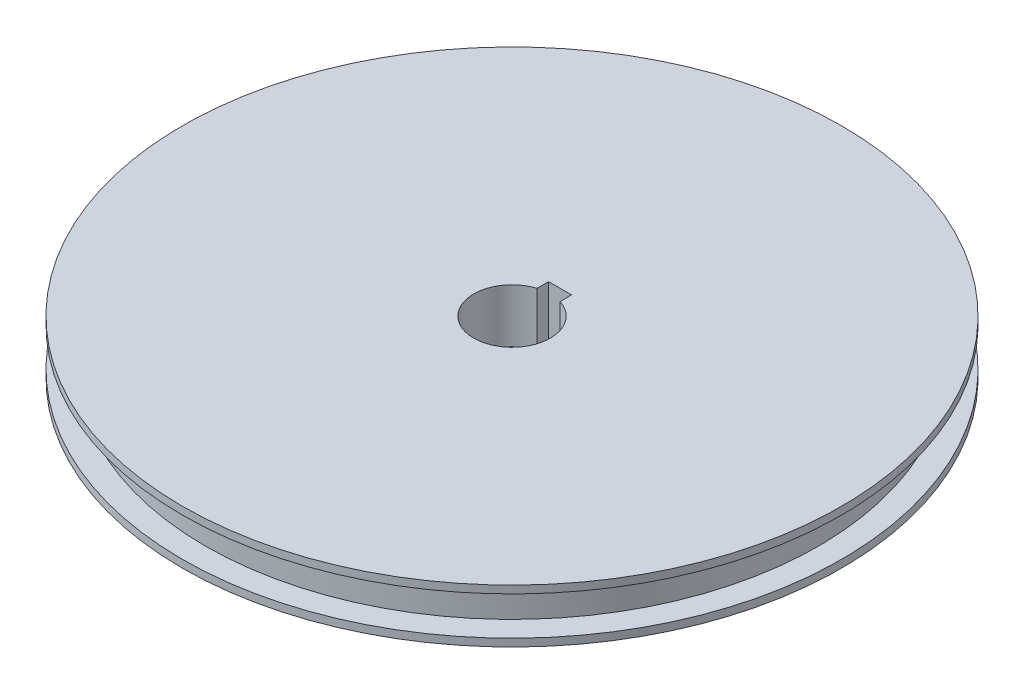
ISO-10303-21;
HEADER;
FILE_DESCRIPTION(('STEP AP214'),'2;1');
FILE_NAME('part.step','',(''),(''),'','','');
FILE_SCHEMA(('AUTOMOTIVE_DESIGN { 1 0 10303 214 1 1 1 1 }'));
ENDSEC;
DATA;
#1=APPLICATION_CONTEXT('core data for automotive mechanical design processes');
#2=APPLICATION_PROTOCOL_DEFINITION('international standard','automotive_design',2000,#1);
#3=PRODUCT_CONTEXT('',#1,'mechanical');
#4=PRODUCT('Part','Part','',(#3));
#5=PRODUCT_RELATED_PRODUCT_CATEGORY('part','',(#4));
#6=PRODUCT_DEFINITION_FORMATION('','',#4);
#7=PRODUCT_DEFINITION_CONTEXT('part definition',#1,'design');
#8=PRODUCT_DEFINITION('design','',#6,#7);
#9=PRODUCT_DEFINITION_SHAPE('','',#8);
#10=(LENGTH_UNIT() NAMED_UNIT(*) SI_UNIT(.MILLI.,.METRE.));
#11=(NAMED_UNIT(*) PLANE_ANGLE_UNIT() SI_UNIT($,.RADIAN.));
#12=(NAMED_UNIT(*) SI_UNIT($,.STERADIAN.) SOLID_ANGLE_UNIT());
#13=UNCERTAINTY_MEASURE_WITH_UNIT(LENGTH_MEASURE(1.E-05),#10,'distance_accuracy_value','');
#14=(GEOMETRIC_REPRESENTATION_CONTEXT(3) GLOBAL_UNCERTAINTY_ASSIGNED_CONTEXT((#13)) GLOBAL_UNIT_ASSIGNED_CONTEXT((#10,
#11,#12)) REPRESENTATION_CONTEXT('',''));
#15=CARTESIAN_POINT('',(0.,0.,0.));
#16=DIRECTION('',(0.,0.,1.));
#17=DIRECTION('',(1.,0.,0.));
#18=AXIS2_PLACEMENT_3D('',#15,#16,#17);
#19=CARTESIAN_POINT('',(0.,5.,0.));
#20=DIRECTION('',(0.,-1.,0.));
#21=DIRECTION('',(0.,0.,-1.));
#22=AXIS2_PLACEMENT_3D('',#19,#20,#21);
#23=CYLINDRICAL_SURFACE('',#22,5.);
#24=DIRECTION('',(0.,-1.,0.));
#25=VECTOR('',#24,1.);
#26=CARTESIAN_POINT('',(1.5,5.,-4.76969600708473));
#27=LINE('',#26,#25);
#28=CARTESIAN_POINT('',(1.5,6.,-4.76969600708473));
#29=VERTEX_POINT('',#28);
#30=CARTESIAN_POINT('',(1.5,-1.,-4.76969600708473));
#31=VERTEX_POINT('',#30);
#32=EDGE_CURVE('E77',#29,#31,#27,.T.);
#33=ORIENTED_EDGE('',*,*,#32,.T.);
#34=CARTESIAN_POINT('',(0.,-1.,0.));
#35=DIRECTION('',(0.,1.,0.));
#36=DIRECTION('',(0.,0.,1.));
#37=AXIS2_PLACEMENT_3D('',#34,#35,#36);
#38=CIRCLE('',#37,5.);
#39=CARTESIAN_POINT('',(-1.5,-1.,-4.76969600708473));
#40=VERTEX_POINT('',#39);
#41=EDGE_CURVE('E150',#40,#31,#38,.T.);
#42=ORIENTED_EDGE('',*,*,#41,.F.);
#43=DIRECTION('',(0.,-1.,0.));
#44=VECTOR('',#43,1.);
#45=CARTESIAN_POINT('',(-1.5,5.,-4.76969600708473));
#46=LINE('',#45,#44);
#47=CARTESIAN_POINT('',(-1.5,6.,-4.76969600708473));
#48=VERTEX_POINT('',#47);
#49=EDGE_CURVE('E13',#48,#40,#46,.T.);
#50=ORIENTED_EDGE('',*,*,#49,.F.);
#51=CARTESIAN_POINT('',(0.,6.,0.));
#52=DIRECTION('',(0.,1.,0.));
#53=DIRECTION('',(0.,0.,1.));
#54=AXIS2_PLACEMENT_3D('',#51,#52,#53);
#55=CIRCLE('',#54,5.);
#56=EDGE_CURVE('E109',#48,#29,#55,.T.);
#57=ORIENTED_EDGE('',*,*,#56,.T.);
#58=EDGE_LOOP('',(#33,#42,#50,#57));
#59=FACE_BOUND('',#58,.T.);
#60=ADVANCED_FACE('F62',(#59),#23,.F.);
#61=CARTESIAN_POINT('',(-1.5,5.,0.));
#62=DIRECTION('',(-1.,0.,0.));
#63=DIRECTION('',(0.,0.,1.));
#64=AXIS2_PLACEMENT_3D('',#61,#62,#63);
#65=PLANE('',#64);
#66=ORIENTED_EDGE('',*,*,#49,.T.);
#67=DIRECTION('',(0.,0.,-1.));
#68=VECTOR('',#67,1.);
#69=CARTESIAN_POINT('',(-1.5,-1.,0.));
#70=LINE('',#69,#68);
#71=CARTESIAN_POINT('',(-1.5,-1.,-6.26969600708473));
#72=VERTEX_POINT('',#71);
#73=EDGE_CURVE('E145',#40,#72,#70,.T.);
#74=ORIENTED_EDGE('',*,*,#73,.T.);
#75=DIRECTION('',(0.,-1.,0.));
#76=VECTOR('',#75,1.);
#77=CARTESIAN_POINT('',(-1.5,5.,-6.26969600708473));
#78=LINE('',#77,#76);
#79=CARTESIAN_POINT('',(-1.5,6.,-6.26969600708473));
#80=VERTEX_POINT('',#79);
#81=EDGE_CURVE('E70',#80,#72,#78,.T.);
#82=ORIENTED_EDGE('',*,*,#81,.F.);
#83=DIRECTION('',(0.,0.,1.));
#84=VECTOR('',#83,1.);
#85=CARTESIAN_POINT('',(-1.5,6.,0.));
#86=LINE('',#85,#84);
#87=EDGE_CURVE('E114',#80,#48,#86,.T.);
#88=ORIENTED_EDGE('',*,*,#87,.T.);
#89=EDGE_LOOP('',(#66,#74,#82,#88));
#90=FACE_BOUND('',#89,.T.);
#91=ADVANCED_FACE('F148',(#90),#65,.F.);
#92=CARTESIAN_POINT('',(0.,5.,-6.26969600708473));
#93=DIRECTION('',(0.,0.,-1.));
#94=DIRECTION('',(-1.,0.,0.));
#95=AXIS2_PLACEMENT_3D('',#92,#93,#94);
#96=PLANE('',#95);
#97=ORIENTED_EDGE('',*,*,#81,.T.);
#98=DIRECTION('',(1.,0.,0.));
#99=VECTOR('',#98,1.);
#100=CARTESIAN_POINT('',(0.,-1.,-6.26969600708473));
#101=LINE('',#100,#99);
#102=CARTESIAN_POINT('',(1.5,-1.,-6.26969600708473));
#103=VERTEX_POINT('',#102);
#104=EDGE_CURVE('E138',#72,#103,#101,.T.);
#105=ORIENTED_EDGE('',*,*,#104,.T.);
#106=DIRECTION('',(0.,-1.,0.));
#107=VECTOR('',#106,1.);
#108=CARTESIAN_POINT('',(1.5,5.,-6.26969600708473));
#109=LINE('',#108,#107);
#110=CARTESIAN_POINT('',(1.5,6.,-6.26969600708473));
#111=VERTEX_POINT('',#110);
#112=EDGE_CURVE('E84',#111,#103,#109,.T.);
#113=ORIENTED_EDGE('',*,*,#112,.F.);
#114=DIRECTION('',(-1.,0.,0.));
#115=VECTOR('',#114,1.);
#116=CARTESIAN_POINT('',(0.,6.,-6.26969600708473));
#117=LINE('',#116,#115);
#118=EDGE_CURVE('E119',#111,#80,#117,.T.);
#119=ORIENTED_EDGE('',*,*,#118,.T.);
#120=EDGE_LOOP('',(#97,#105,#113,#119));
#121=FACE_BOUND('',#120,.T.);
#122=ADVANCED_FACE('F137',(#121),#96,.F.);
#123=CARTESIAN_POINT('',(1.5,5.,0.));
#124=DIRECTION('',(-1.,0.,0.));
#125=DIRECTION('',(0.,0.,1.));
#126=AXIS2_PLACEMENT_3D('',#123,#124,#125);
#127=PLANE('',#126);
#128=ORIENTED_EDGE('',*,*,#112,.T.);
#129=DIRECTION('',(0.,0.,-1.));
#130=VECTOR('',#129,1.);
#131=CARTESIAN_POINT('',(1.5,-1.,0.));
#132=LINE('',#131,#130);
#133=EDGE_CURVE('E104',#31,#103,#132,.T.);
#134=ORIENTED_EDGE('',*,*,#133,.F.);
#135=ORIENTED_EDGE('',*,*,#32,.F.);
#136=DIRECTION('',(0.,0.,1.));
#137=VECTOR('',#136,1.);
#138=CARTESIAN_POINT('',(1.5,6.,0.));
#139=LINE('',#138,#137);
#140=EDGE_CURVE('E102',#111,#29,#139,.T.);
#141=ORIENTED_EDGE('',*,*,#140,.F.);
#142=EDGE_LOOP('',(#128,#134,#135,#141));
#143=FACE_BOUND('',#142,.T.);
#144=ADVANCED_FACE('F100',(#143),#127,.T.);
#145=CARTESIAN_POINT('',(0.,5.,0.));
#146=DIRECTION('',(0.,-1.,0.));
#147=DIRECTION('',(0.,0.,-1.));
#148=AXIS2_PLACEMENT_3D('',#145,#146,#147);
#149=CYLINDRICAL_SURFACE('',#148,40.);
#150=CARTESIAN_POINT('',(0.,5.,0.));
#151=DIRECTION('',(0.,1.,0.));
#152=DIRECTION('',(0.,0.,1.));
#153=AXIS2_PLACEMENT_3D('',#150,#151,#152);
#154=CIRCLE('',#153,40.);
#155=CARTESIAN_POINT('',(0.,5.,40.));
#156=VERTEX_POINT('',#155);
#157=EDGE_CURVE('E107',#156,#156,#154,.T.);
#158=ORIENTED_EDGE('',*,*,#157,.F.);
#159=EDGE_LOOP('',(#158));
#160=FACE_BOUND('',#159,.T.);
#161=CARTESIAN_POINT('',(0.,0.,0.));
#162=DIRECTION('',(0.,1.,0.));
#163=DIRECTION('',(0.,0.,1.));
#164=AXIS2_PLACEMENT_3D('',#161,#162,#163);
#165=CIRCLE('',#164,40.);
#166=CARTESIAN_POINT('',(0.,0.,40.));
#167=VERTEX_POINT('',#166);
#168=EDGE_CURVE('E164',#167,#167,#165,.T.);
#169=ORIENTED_EDGE('',*,*,#168,.T.);
#170=EDGE_LOOP('',(#169));
#171=FACE_BOUND('',#170,.T.);
#172=ADVANCED_FACE('F176',(#160,#171),#149,.T.);
#173=CARTESIAN_POINT('',(0.,-1.,0.));
#174=DIRECTION('',(0.,1.,0.));
#175=DIRECTION('',(0.,0.,1.));
#176=AXIS2_PLACEMENT_3D('',#173,#174,#175);
#177=CYLINDRICAL_SURFACE('',#176,43.);
#178=CARTESIAN_POINT('',(0.,-1.,0.));
#179=DIRECTION('',(0.,1.,0.));
#180=DIRECTION('',(0.,0.,1.));
#181=AXIS2_PLACEMENT_3D('',#178,#179,#180);
#182=CIRCLE('',#181,43.);
#183=CARTESIAN_POINT('',(0.,-1.,43.));
#184=VERTEX_POINT('',#183);
#185=EDGE_CURVE('E160',#184,#184,#182,.T.);
#186=ORIENTED_EDGE('',*,*,#185,.T.);
#187=EDGE_LOOP('',(#186));
#188=FACE_BOUND('',#187,.T.);
#189=CARTESIAN_POINT('',(0.,0.,0.));
#190=DIRECTION('',(0.,1.,0.));
#191=DIRECTION('',(0.,0.,1.));
#192=AXIS2_PLACEMENT_3D('',#189,#190,#191);
#193=CIRCLE('',#192,43.);
#194=CARTESIAN_POINT('',(0.,0.,43.));
#195=VERTEX_POINT('',#194);
#196=EDGE_CURVE('E154',#195,#195,#193,.T.);
#197=ORIENTED_EDGE('',*,*,#196,.F.);
#198=EDGE_LOOP('',(#197));
#199=FACE_BOUND('',#198,.T.);
#200=ADVANCED_FACE('F185',(#188,#199),#177,.T.);
#201=CARTESIAN_POINT('',(0.,-1.,0.));
#202=DIRECTION('',(0.,1.,0.));
#203=DIRECTION('',(0.,0.,1.));
#204=AXIS2_PLACEMENT_3D('',#201,#202,#203);
#205=PLANE('',#204);
#206=ORIENTED_EDGE('',*,*,#41,.T.);
#207=ORIENTED_EDGE('',*,*,#133,.T.);
#208=ORIENTED_EDGE('',*,*,#104,.F.);
#209=ORIENTED_EDGE('',*,*,#73,.F.);
#210=EDGE_LOOP('',(#206,#207,#208,#209));
#211=FACE_BOUND('',#210,.T.);
#212=ORIENTED_EDGE('',*,*,#185,.F.);
#213=EDGE_LOOP('',(#212));
#214=FACE_BOUND('',#213,.T.);
#215=ADVANCED_FACE('F143',(#211,#214),#205,.F.);
#216=CARTESIAN_POINT('',(0.,0.,0.));
#217=DIRECTION('',(0.,1.,0.));
#218=DIRECTION('',(0.,0.,1.));
#219=AXIS2_PLACEMENT_3D('',#216,#217,#218);
#220=PLANE('',#219);
#221=ORIENTED_EDGE('',*,*,#168,.F.);
#222=EDGE_LOOP('',(#221));
#223=FACE_BOUND('',#222,.T.);
#224=ORIENTED_EDGE('',*,*,#196,.T.);
#225=EDGE_LOOP('',(#224));
#226=FACE_BOUND('',#225,.T.);
#227=ADVANCED_FACE('F178',(#223,#226),#220,.T.);
#228=CARTESIAN_POINT('',(0.,6.,0.));
#229=DIRECTION('',(0.,-1.,0.));
#230=DIRECTION('',(0.,0.,-1.));
#231=AXIS2_PLACEMENT_3D('',#228,#229,#230);
#232=CYLINDRICAL_SURFACE('',#231,43.);
#233=CARTESIAN_POINT('',(0.,6.,0.));
#234=DIRECTION('',(0.,1.,0.));
#235=DIRECTION('',(0.,0.,1.));
#236=AXIS2_PLACEMENT_3D('',#233,#234,#235);
#237=CIRCLE('',#236,43.);
#238=CARTESIAN_POINT('',(0.,6.,43.));
#239=VERTEX_POINT('',#238);
#240=EDGE_CURVE('E168',#239,#239,#237,.T.);
#241=ORIENTED_EDGE('',*,*,#240,.F.);
#242=EDGE_LOOP('',(#241));
#243=FACE_BOUND('',#242,.T.);
#244=CARTESIAN_POINT('',(0.,5.,0.));
#245=DIRECTION('',(0.,1.,0.));
#246=DIRECTION('',(0.,0.,1.));
#247=AXIS2_PLACEMENT_3D('',#244,#245,#246);
#248=CIRCLE('',#247,43.);
#249=CARTESIAN_POINT('',(0.,5.,43.));
#250=VERTEX_POINT('',#249);
#251=EDGE_CURVE('E337',#250,#250,#248,.T.);
#252=ORIENTED_EDGE('',*,*,#251,.T.);
#253=EDGE_LOOP('',(#252));
#254=FACE_BOUND('',#253,.T.);
#255=ADVANCED_FACE('F181',(#243,#254),#232,.T.);
#256=CARTESIAN_POINT('',(0.,6.,0.));
#257=DIRECTION('',(0.,1.,0.));
#258=DIRECTION('',(0.,0.,1.));
#259=AXIS2_PLACEMENT_3D('',#256,#257,#258);
#260=PLANE('',#259);
#261=ORIENTED_EDGE('',*,*,#140,.T.);
#262=ORIENTED_EDGE('',*,*,#56,.F.);
#263=ORIENTED_EDGE('',*,*,#87,.F.);
#264=ORIENTED_EDGE('',*,*,#118,.F.);
#265=EDGE_LOOP('',(#261,#262,#263,#264));
#266=FACE_BOUND('',#265,.T.);
#267=ORIENTED_EDGE('',*,*,#240,.T.);
#268=EDGE_LOOP('',(#267));
#269=FACE_BOUND('',#268,.T.);
#270=ADVANCED_FACE('F116',(#266,#269),#260,.T.);
#271=CARTESIAN_POINT('',(0.,5.,0.));
#272=DIRECTION('',(0.,1.,0.));
#273=DIRECTION('',(0.,0.,1.));
#274=AXIS2_PLACEMENT_3D('',#271,#272,#273);
#275=PLANE('',#274);
#276=ORIENTED_EDGE('',*,*,#157,.T.);
#277=EDGE_LOOP('',(#276));
#278=FACE_BOUND('',#277,.T.);
#279=ORIENTED_EDGE('',*,*,#251,.F.);
#280=EDGE_LOOP('',(#279));
#281=FACE_BOUND('',#280,.T.);
#282=ADVANCED_FACE('F249',(#278,#281),#275,.F.);
#283=CLOSED_SHELL('',(#60,#91,#122,#144,#172,#200,#215,#227,#255,#270,#282));
#284=MANIFOLD_SOLID_BREP('B2',#283);
#285=ADVANCED_BREP_SHAPE_REPRESENTATION('',(#18,#284),#14);
#286=SHAPE_DEFINITION_REPRESENTATION(#9,#285);
ENDSEC;
END-ISO-10303-21;
